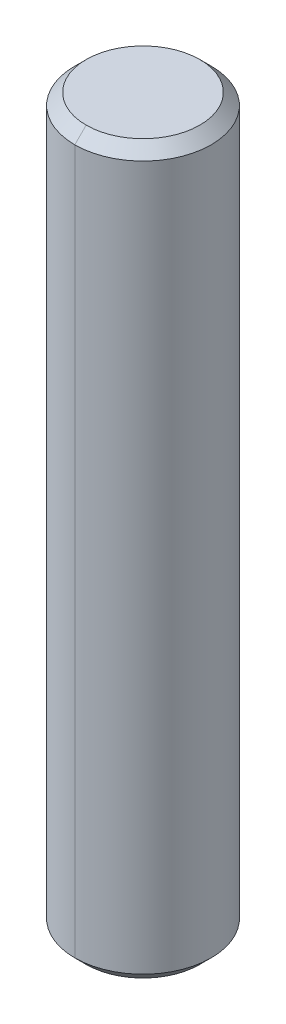
ISO-10303-21;
HEADER;
FILE_DESCRIPTION(('STEP AP214'),'2;1');
FILE_NAME('part.step','',(''),(''),'','','');
FILE_SCHEMA(('AUTOMOTIVE_DESIGN { 1 0 10303 214 1 1 1 1 }'));
ENDSEC;
DATA;
#1=APPLICATION_CONTEXT('core data for automotive mechanical design processes');
#2=APPLICATION_PROTOCOL_DEFINITION('international standard','automotive_design',2000,#1);
#3=PRODUCT_CONTEXT('',#1,'mechanical');
#4=PRODUCT('Part','Part','',(#3));
#5=PRODUCT_RELATED_PRODUCT_CATEGORY('part','',(#4));
#6=PRODUCT_DEFINITION_FORMATION('','',#4);
#7=PRODUCT_DEFINITION_CONTEXT('part definition',#1,'design');
#8=PRODUCT_DEFINITION('design','',#6,#7);
#9=PRODUCT_DEFINITION_SHAPE('','',#8);
#10=(LENGTH_UNIT() NAMED_UNIT(*) SI_UNIT(.MILLI.,.METRE.));
#11=(NAMED_UNIT(*) PLANE_ANGLE_UNIT() SI_UNIT($,.RADIAN.));
#12=(NAMED_UNIT(*) SI_UNIT($,.STERADIAN.) SOLID_ANGLE_UNIT());
#13=UNCERTAINTY_MEASURE_WITH_UNIT(LENGTH_MEASURE(1.E-05),#10,'distance_accuracy_value','');
#14=(GEOMETRIC_REPRESENTATION_CONTEXT(3) GLOBAL_UNCERTAINTY_ASSIGNED_CONTEXT((#13)) GLOBAL_UNIT_ASSIGNED_CONTEXT((#10,
#11,#12)) REPRESENTATION_CONTEXT('',''));
#15=CARTESIAN_POINT('',(0.,0.,0.));
#16=DIRECTION('',(0.,0.,1.));
#17=DIRECTION('',(1.,0.,0.));
#18=AXIS2_PLACEMENT_3D('',#15,#16,#17);
#19=CARTESIAN_POINT('',(0.,8.,0.));
#20=DIRECTION('',(0.,-1.,0.));
#21=DIRECTION('',(0.,0.,-1.));
#22=AXIS2_PLACEMENT_3D('',#19,#20,#21);
#23=CONICAL_SURFACE('',#22,1.251,0.785398163397445);
#24=DIRECTION('',(0.,-0.70710678118655,0.707106781186545));
#25=VECTOR('',#24,1.);
#26=CARTESIAN_POINT('',(0.,8.,1.251));
#27=LINE('',#26,#25);
#28=CARTESIAN_POINT('',(0.,8.,1.251));
#29=VERTEX_POINT('',#28);
#30=CARTESIAN_POINT('',(0.,7.75,1.501));
#31=VERTEX_POINT('',#30);
#32=EDGE_CURVE('E102',#29,#31,#27,.T.);
#33=ORIENTED_EDGE('',*,*,#32,.F.);
#34=CARTESIAN_POINT('',(0.,8.,0.));
#35=DIRECTION('',(0.,1.,0.));
#36=DIRECTION('',(0.,0.,1.));
#37=AXIS2_PLACEMENT_3D('',#34,#35,#36);
#38=CIRCLE('',#37,1.251);
#39=CARTESIAN_POINT('',(0.,8.,-1.251));
#40=VERTEX_POINT('',#39);
#41=EDGE_CURVE('E27',#40,#29,#38,.T.);
#42=ORIENTED_EDGE('',*,*,#41,.F.);
#43=DIRECTION('',(0.,-0.70710678118655,-0.707106781186545));
#44=VECTOR('',#43,1.);
#45=CARTESIAN_POINT('',(0.,8.,-1.251));
#46=LINE('',#45,#44);
#47=CARTESIAN_POINT('',(0.,7.75,-1.501));
#48=VERTEX_POINT('',#47);
#49=EDGE_CURVE('E85',#40,#48,#46,.T.);
#50=ORIENTED_EDGE('',*,*,#49,.T.);
#51=CARTESIAN_POINT('',(0.,7.75,0.));
#52=DIRECTION('',(0.,-1.,0.));
#53=DIRECTION('',(0.,0.,1.));
#54=AXIS2_PLACEMENT_3D('',#51,#52,#53);
#55=CIRCLE('',#54,1.501);
#56=EDGE_CURVE('E101',#31,#48,#55,.T.);
#57=ORIENTED_EDGE('',*,*,#56,.F.);
#58=EDGE_LOOP('',(#33,#42,#50,#57));
#59=FACE_BOUND('',#58,.T.);
#60=ADVANCED_FACE('F16',(#59),#23,.T.);
#61=CARTESIAN_POINT('',(0.,-7.75,0.));
#62=DIRECTION('',(0.,1.,0.));
#63=DIRECTION('',(0.,0.,1.));
#64=AXIS2_PLACEMENT_3D('',#61,#62,#63);
#65=CONICAL_SURFACE('',#64,1.501,0.785398163397454);
#66=DIRECTION('',(0.,0.707106781186544,-0.707106781186552));
#67=VECTOR('',#66,1.);
#68=CARTESIAN_POINT('',(0.,-7.75,-1.501));
#69=LINE('',#68,#67);
#70=CARTESIAN_POINT('',(0.,-8.,-1.251));
#71=VERTEX_POINT('',#70);
#72=CARTESIAN_POINT('',(0.,-7.75,-1.501));
#73=VERTEX_POINT('',#72);
#74=EDGE_CURVE('E72',#71,#73,#69,.T.);
#75=ORIENTED_EDGE('',*,*,#74,.F.);
#76=CARTESIAN_POINT('',(0.,-8.,0.));
#77=DIRECTION('',(0.,-1.,0.));
#78=DIRECTION('',(0.,0.,1.));
#79=AXIS2_PLACEMENT_3D('',#76,#77,#78);
#80=CIRCLE('',#79,1.251);
#81=CARTESIAN_POINT('',(0.,-8.,1.251));
#82=VERTEX_POINT('',#81);
#83=EDGE_CURVE('E11',#82,#71,#80,.T.);
#84=ORIENTED_EDGE('',*,*,#83,.F.);
#85=DIRECTION('',(0.,0.707106781186544,0.707106781186552));
#86=VECTOR('',#85,1.);
#87=CARTESIAN_POINT('',(0.,-7.75,1.501));
#88=LINE('',#87,#86);
#89=CARTESIAN_POINT('',(0.,-7.75,1.501));
#90=VERTEX_POINT('',#89);
#91=EDGE_CURVE('E69',#82,#90,#88,.T.);
#92=ORIENTED_EDGE('',*,*,#91,.T.);
#93=CARTESIAN_POINT('',(0.,-7.75,0.));
#94=DIRECTION('',(0.,1.,0.));
#95=DIRECTION('',(0.,0.,1.));
#96=AXIS2_PLACEMENT_3D('',#93,#94,#95);
#97=CIRCLE('',#96,1.501);
#98=EDGE_CURVE('E41',#73,#90,#97,.T.);
#99=ORIENTED_EDGE('',*,*,#98,.F.);
#100=EDGE_LOOP('',(#75,#84,#92,#99));
#101=FACE_BOUND('',#100,.T.);
#102=ADVANCED_FACE('F68',(#101),#65,.T.);
#103=CARTESIAN_POINT('',(0.,-8.,0.));
#104=DIRECTION('',(0.,1.,0.));
#105=DIRECTION('',(1.,0.,0.));
#106=AXIS2_PLACEMENT_3D('',#103,#104,#105);
#107=PLANE('',#106);
#108=ORIENTED_EDGE('',*,*,#83,.T.);
#109=CARTESIAN_POINT('',(0.,-8.,0.));
#110=DIRECTION('',(0.,-1.,0.));
#111=DIRECTION('',(0.,0.,1.));
#112=AXIS2_PLACEMENT_3D('',#109,#110,#111);
#113=CIRCLE('',#112,1.251);
#114=EDGE_CURVE('E77',#71,#82,#113,.T.);
#115=ORIENTED_EDGE('',*,*,#114,.T.);
#116=EDGE_LOOP('',(#108,#115));
#117=FACE_BOUND('',#116,.T.);
#118=ADVANCED_FACE('F83',(#117),#107,.F.);
#119=CARTESIAN_POINT('',(0.,8.,0.));
#120=DIRECTION('',(0.,1.,0.));
#121=DIRECTION('',(1.,0.,0.));
#122=AXIS2_PLACEMENT_3D('',#119,#120,#121);
#123=PLANE('',#122);
#124=ORIENTED_EDGE('',*,*,#41,.T.);
#125=CARTESIAN_POINT('',(0.,8.,0.));
#126=DIRECTION('',(0.,1.,0.));
#127=DIRECTION('',(0.,0.,1.));
#128=AXIS2_PLACEMENT_3D('',#125,#126,#127);
#129=CIRCLE('',#128,1.251);
#130=EDGE_CURVE('E20',#29,#40,#129,.T.);
#131=ORIENTED_EDGE('',*,*,#130,.T.);
#132=EDGE_LOOP('',(#124,#131));
#133=FACE_BOUND('',#132,.T.);
#134=ADVANCED_FACE('F134',(#133),#123,.T.);
#135=CARTESIAN_POINT('',(0.,8.,0.));
#136=DIRECTION('',(0.,-1.,0.));
#137=DIRECTION('',(0.,0.,-1.));
#138=AXIS2_PLACEMENT_3D('',#135,#136,#137);
#139=CYLINDRICAL_SURFACE('',#138,1.501);
#140=DIRECTION('',(0.,-1.,0.));
#141=VECTOR('',#140,1.);
#142=CARTESIAN_POINT('',(0.,8.,1.501));
#143=LINE('',#142,#141);
#144=EDGE_CURVE('E81',#31,#90,#143,.T.);
#145=ORIENTED_EDGE('',*,*,#144,.F.);
#146=ORIENTED_EDGE('',*,*,#56,.T.);
#147=DIRECTION('',(0.,-1.,0.));
#148=VECTOR('',#147,1.);
#149=CARTESIAN_POINT('',(0.,8.,-1.501));
#150=LINE('',#149,#148);
#151=EDGE_CURVE('E99',#48,#73,#150,.T.);
#152=ORIENTED_EDGE('',*,*,#151,.T.);
#153=ORIENTED_EDGE('',*,*,#98,.T.);
#154=EDGE_LOOP('',(#145,#146,#152,#153));
#155=FACE_BOUND('',#154,.T.);
#156=ADVANCED_FACE('F123',(#155),#139,.T.);
#157=CARTESIAN_POINT('',(0.,8.,0.));
#158=DIRECTION('',(0.,-1.,0.));
#159=DIRECTION('',(0.,0.,-1.));
#160=AXIS2_PLACEMENT_3D('',#157,#158,#159);
#161=CYLINDRICAL_SURFACE('',#160,1.501);
#162=CARTESIAN_POINT('',(0.,7.75,0.));
#163=DIRECTION('',(0.,-1.,0.));
#164=DIRECTION('',(0.,0.,1.));
#165=AXIS2_PLACEMENT_3D('',#162,#163,#164);
#166=CIRCLE('',#165,1.501);
#167=EDGE_CURVE('E95',#48,#31,#166,.T.);
#168=ORIENTED_EDGE('',*,*,#167,.T.);
#169=ORIENTED_EDGE('',*,*,#144,.T.);
#170=CARTESIAN_POINT('',(0.,-7.75,0.));
#171=DIRECTION('',(0.,1.,0.));
#172=DIRECTION('',(0.,0.,1.));
#173=AXIS2_PLACEMENT_3D('',#170,#171,#172);
#174=CIRCLE('',#173,1.501);
#175=EDGE_CURVE('E79',#90,#73,#174,.T.);
#176=ORIENTED_EDGE('',*,*,#175,.T.);
#177=ORIENTED_EDGE('',*,*,#151,.F.);
#178=EDGE_LOOP('',(#168,#169,#176,#177));
#179=FACE_BOUND('',#178,.T.);
#180=ADVANCED_FACE('F124',(#179),#161,.T.);
#181=CARTESIAN_POINT('',(0.,-7.75,0.));
#182=DIRECTION('',(0.,1.,0.));
#183=DIRECTION('',(0.,0.,1.));
#184=AXIS2_PLACEMENT_3D('',#181,#182,#183);
#185=CONICAL_SURFACE('',#184,1.501,0.785398163397454);
#186=ORIENTED_EDGE('',*,*,#114,.F.);
#187=ORIENTED_EDGE('',*,*,#74,.T.);
#188=ORIENTED_EDGE('',*,*,#175,.F.);
#189=ORIENTED_EDGE('',*,*,#91,.F.);
#190=EDGE_LOOP('',(#186,#187,#188,#189));
#191=FACE_BOUND('',#190,.T.);
#192=ADVANCED_FACE('F18',(#191),#185,.T.);
#193=CARTESIAN_POINT('',(0.,8.,0.));
#194=DIRECTION('',(0.,-1.,0.));
#195=DIRECTION('',(0.,0.,-1.));
#196=AXIS2_PLACEMENT_3D('',#193,#194,#195);
#197=CONICAL_SURFACE('',#196,1.251,0.785398163397445);
#198=ORIENTED_EDGE('',*,*,#130,.F.);
#199=ORIENTED_EDGE('',*,*,#32,.T.);
#200=ORIENTED_EDGE('',*,*,#167,.F.);
#201=ORIENTED_EDGE('',*,*,#49,.F.);
#202=EDGE_LOOP('',(#198,#199,#200,#201));
#203=FACE_BOUND('',#202,.T.);
#204=ADVANCED_FACE('F133',(#203),#197,.T.);
#205=CLOSED_SHELL('',(#60,#102,#118,#134,#156,#180,#192,#204));
#206=MANIFOLD_SOLID_BREP('B1',#205);
#207=ADVANCED_BREP_SHAPE_REPRESENTATION('',(#18,#206),#14);
#208=SHAPE_DEFINITION_REPRESENTATION(#9,#207);
ENDSEC;
END-ISO-10303-21;
